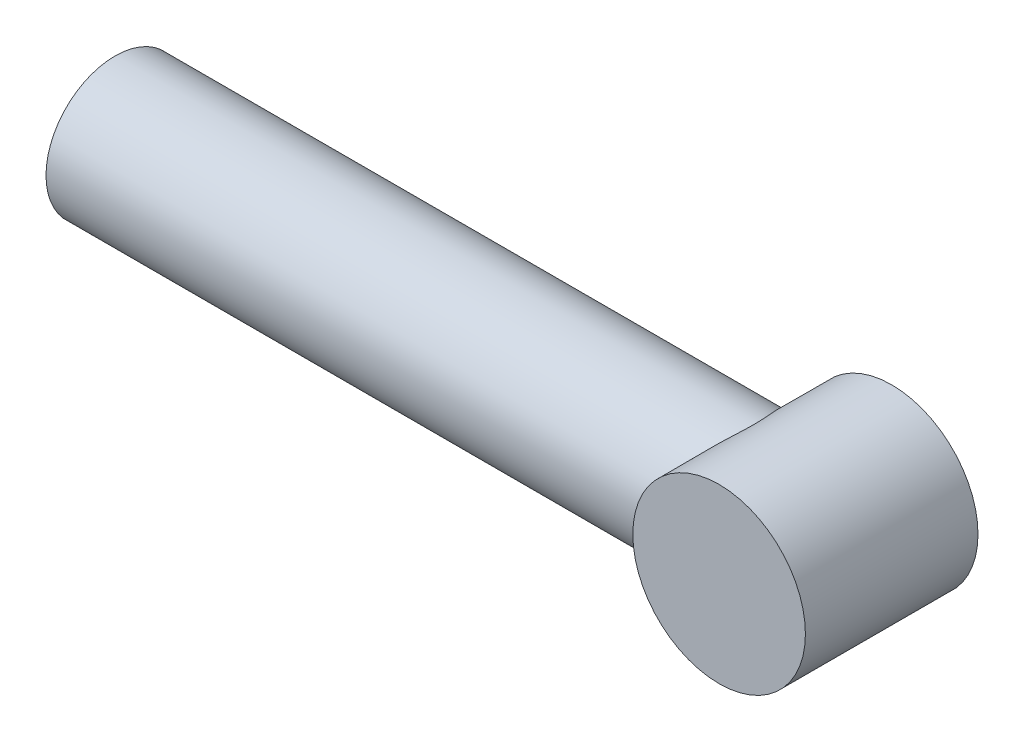
ISO-10303-21;
HEADER;
FILE_DESCRIPTION(('STEP AP214'),'2;1');
FILE_NAME('part.step','',(''),(''),'','','');
FILE_SCHEMA(('AUTOMOTIVE_DESIGN { 1 0 10303 214 1 1 1 1 }'));
ENDSEC;
DATA;
#1=APPLICATION_CONTEXT('core data for automotive mechanical design processes');
#2=APPLICATION_PROTOCOL_DEFINITION('international standard','automotive_design',2000,#1);
#3=PRODUCT_CONTEXT('',#1,'mechanical');
#4=PRODUCT('Part','Part','',(#3));
#5=PRODUCT_RELATED_PRODUCT_CATEGORY('part','',(#4));
#6=PRODUCT_DEFINITION_FORMATION('','',#4);
#7=PRODUCT_DEFINITION_CONTEXT('part definition',#1,'design');
#8=PRODUCT_DEFINITION('design','',#6,#7);
#9=PRODUCT_DEFINITION_SHAPE('','',#8);
#10=(LENGTH_UNIT() NAMED_UNIT(*) SI_UNIT(.MILLI.,.METRE.));
#11=(NAMED_UNIT(*) PLANE_ANGLE_UNIT() SI_UNIT($,.RADIAN.));
#12=(NAMED_UNIT(*) SI_UNIT($,.STERADIAN.) SOLID_ANGLE_UNIT());
#13=UNCERTAINTY_MEASURE_WITH_UNIT(LENGTH_MEASURE(1.E-05),#10,'distance_accuracy_value','');
#14=(GEOMETRIC_REPRESENTATION_CONTEXT(3) GLOBAL_UNCERTAINTY_ASSIGNED_CONTEXT((#13)) GLOBAL_UNIT_ASSIGNED_CONTEXT((#10,
#11,#12)) REPRESENTATION_CONTEXT('',''));
#15=CARTESIAN_POINT('',(0.,0.,0.));
#16=DIRECTION('',(0.,0.,1.));
#17=DIRECTION('',(1.,0.,0.));
#18=AXIS2_PLACEMENT_3D('',#15,#16,#17);
#19=CARTESIAN_POINT('',(200.,0.,0.));
#20=DIRECTION('',(-1.,0.,0.));
#21=DIRECTION('',(0.,0.,1.));
#22=AXIS2_PLACEMENT_3D('',#19,#20,#21);
#23=CYLINDRICAL_SURFACE('',#22,40.);
#24=CARTESIAN_POINT('',(-200.,0.,0.));
#25=DIRECTION('',(1.,0.,0.));
#26=DIRECTION('',(0.,0.,-1.));
#27=AXIS2_PLACEMENT_3D('',#24,#25,#26);
#28=CIRCLE('',#27,40.);
#29=CARTESIAN_POINT('',(-200.,0.,-40.));
#30=VERTEX_POINT('',#29);
#31=EDGE_CURVE('E55',#30,#30,#28,.T.);
#32=ORIENTED_EDGE('',*,*,#31,.T.);
#33=EDGE_LOOP('',(#32));
#34=FACE_BOUND('',#33,.T.);
#35=CARTESIAN_POINT('',(150.,0.,40.));
#36=CARTESIAN_POINT('',(150.000009713421,-0.960337317603065,39.9999899655505));
#37=CARTESIAN_POINT('',(150.027738093411,-1.92103825174153,39.965344130341));
#38=CARTESIAN_POINT('',(150.138036575608,-3.83460710770069,39.8273406683373));
#39=CARTESIAN_POINT('',(150.220635700476,-4.78747061392242,39.7239466787068));
#40=CARTESIAN_POINT('',(150.438963093926,-6.67920680850692,39.4500093404149));
#41=CARTESIAN_POINT('',(150.574792912782,-7.6180491730509,39.2793376397602));
#42=CARTESIAN_POINT('',(150.896514362471,-9.47278784316619,38.8737383716902));
#43=CARTESIAN_POINT('',(151.082400408243,-10.3886866962233,38.6388179728265));
#44=CARTESIAN_POINT('',(151.499010365285,-12.1860448986504,38.1100030483728));
#45=CARTESIAN_POINT('',(151.729439229498,-13.0676873720396,37.8164961975772));
#46=CARTESIAN_POINT('',(152.231519331761,-14.7981074225095,37.1734863365716));
#47=CARTESIAN_POINT('',(152.503170827585,-15.6468847940366,36.8239829762036));
#48=CARTESIAN_POINT('',(153.082928762828,-17.3078631155302,36.0730992030751));
#49=CARTESIAN_POINT('',(153.391026088426,-18.1200731398626,35.6717317573903));
#50=CARTESIAN_POINT('',(154.039000463517,-19.7058441108158,34.8208209286232));
#51=CARTESIAN_POINT('',(154.378884012283,-20.4793971034718,34.3712676903186));
#52=CARTESIAN_POINT('',(154.970397265871,-21.7405090451485,33.5813865490857));
#53=CARTESIAN_POINT('',(155.214721621661,-22.2391661899703,33.2531653527831));
#54=CARTESIAN_POINT('',(155.71404829788,-23.2175821753519,32.5775571715156));
#55=CARTESIAN_POINT('',(155.969048336455,-23.6973450123228,32.2301742772419));
#56=CARTESIAN_POINT('',(156.748143381878,-25.1083888673531,31.1602744893447));
#57=CARTESIAN_POINT('',(157.286249209809,-26.0112478729574,30.4101180866672));
#58=CARTESIAN_POINT('',(158.389203946291,-27.7416200402566,28.8404448127059));
#59=CARTESIAN_POINT('',(158.954120035809,-28.5689268910585,28.0207491560547));
#60=CARTESIAN_POINT('',(160.097228323747,-30.1449198378464,26.3178577666689));
#61=CARTESIAN_POINT('',(160.675419005744,-30.8936148601352,25.4346692627179));
#62=CARTESIAN_POINT('',(161.841235230747,-32.322928156125,23.5925581067076));
#63=CARTESIAN_POINT('',(162.42886684111,-33.0022979067521,22.6326666595117));
#64=CARTESIAN_POINT('',(163.298699586356,-33.9588113294495,21.145835545534));
#65=CARTESIAN_POINT('',(163.586789697094,-34.2673057721559,20.6422403953403));
#66=CARTESIAN_POINT('',(164.156795460499,-34.8630820045459,19.6192733098945));
#67=CARTESIAN_POINT('',(164.438711722438,-35.1503658941105,19.0999029436206));
#68=CARTESIAN_POINT('',(164.993119025265,-35.7025344651925,18.0466515838975));
#69=CARTESIAN_POINT('',(165.265633401255,-35.9674773777477,17.5128134287131));
#70=CARTESIAN_POINT('',(165.79923868526,-36.4752457872218,16.4290760361571));
#71=CARTESIAN_POINT('',(166.060329022893,-36.7180701804527,15.8791759991228));
#72=CARTESIAN_POINT('',(166.567711527861,-37.1806380629351,14.7636195685688));
#73=CARTESIAN_POINT('',(166.81401489761,-37.4003991215583,14.1979755903776));
#74=CARTESIAN_POINT('',(167.288470170828,-37.8160719858136,13.0505560059611));
#75=CARTESIAN_POINT('',(167.516623295865,-38.0119853969403,12.4687814889329));
#76=CARTESIAN_POINT('',(167.983430430793,-38.4063287968087,11.2008152379521));
#77=CARTESIAN_POINT('',(168.218532227984,-38.6007341429587,10.51204347045));
#78=CARTESIAN_POINT('',(168.653015703361,-38.9543981140488,9.11450642112965));
#79=CARTESIAN_POINT('',(168.852403046248,-39.1136623136884,8.4057443306725));
#80=CARTESIAN_POINT('',(169.208376411789,-39.3945089701146,6.97174066571736));
#81=CARTESIAN_POINT('',(169.36505241666,-39.5161707194822,6.24653727800037));
#82=CARTESIAN_POINT('',(169.629842951554,-39.7200407558248,4.78173507298083));
#83=CARTESIAN_POINT('',(169.737958073255,-39.802249523505,4.04213643118804));
#84=CARTESIAN_POINT('',(169.90133192227,-39.9259430521321,2.54689613390493));
#85=CARTESIAN_POINT('',(169.956108748981,-39.9670566128739,1.79117012816373));
#86=CARTESIAN_POINT('',(170.008270075565,-40.0062151100752,0.276633037623785));
#87=CARTESIAN_POINT('',(170.005657407385,-40.0042621716977,-0.482177893098519));
#88=CARTESIAN_POINT('',(169.943160850268,-39.9573259270323,-1.99661799876617));
#89=CARTESIAN_POINT('',(169.88323541198,-39.9123114028992,-2.75224446591342));
#90=CARTESIAN_POINT('',(169.709146200742,-39.7803459798636,-4.25349313675358));
#91=CARTESIAN_POINT('',(169.594974845164,-39.6933892181461,-4.99911392684136));
#92=CARTESIAN_POINT('',(169.296008176701,-39.4627146667173,-6.59074393125148));
#93=CARTESIAN_POINT('',(169.1029604656,-39.3122468772218,-7.43421699833316));
#94=CARTESIAN_POINT('',(168.661660374706,-38.9613603015859,-9.09582896297411));
#95=CARTESIAN_POINT('',(168.413396080961,-38.7609307341793,-9.91396234958124));
#96=CARTESIAN_POINT('',(167.871685925527,-38.3131195376455,-11.5241061197849));
#97=CARTESIAN_POINT('',(167.578129945175,-38.0656231233099,-12.3160469643134));
#98=CARTESIAN_POINT('',(166.956213556036,-37.5270208256944,-13.8708234257715));
#99=CARTESIAN_POINT('',(166.627850365585,-37.2359114562595,-14.6336567098979));
#100=CARTESIAN_POINT('',(166.03194818967,-36.6918302323134,-15.939723098304));
#101=CARTESIAN_POINT('',(165.770184364865,-36.4479938970039,-16.4894565575485));
#102=CARTESIAN_POINT('',(165.235272407108,-35.9381443116079,-17.5729419964088));
#103=CARTESIAN_POINT('',(164.96212313639,-35.6721288424559,-18.106692369607));
#104=CARTESIAN_POINT('',(164.407174210366,-35.1184343896659,-19.1585214005948));
#105=CARTESIAN_POINT('',(164.125371268155,-34.830747112645,-19.6765939513846));
#106=CARTESIAN_POINT('',(163.555730905886,-34.2342731018837,-20.6969491526196));
#107=CARTESIAN_POINT('',(163.267893658131,-33.9254869700272,-21.1992322528916));
#108=CARTESIAN_POINT('',(162.398052086122,-32.9672187050626,-22.6837299484833));
#109=CARTESIAN_POINT('',(161.810265099411,-32.2863649639095,-23.6425733340181));
#110=CARTESIAN_POINT('',(160.635434104939,-30.8431085653317,-25.4967141258071));
#111=CARTESIAN_POINT('',(160.04838999102,-30.080719317879,-26.3920219414511));
#112=CARTESIAN_POINT('',(158.87294522888,-28.453465810621,-28.1400802220676));
#113=CARTESIAN_POINT('',(158.284929547637,-27.5864034467277,-28.9910480559512));
#114=CARTESIAN_POINT('',(157.137422757778,-25.7673359763549,-30.619173293891));
#115=CARTESIAN_POINT('',(156.577935861927,-24.8153183815294,-31.3963198114988));
#116=CARTESIAN_POINT('',(155.771056129462,-23.3263522450451,-32.5001847567502));
#117=CARTESIAN_POINT('',(155.507733313988,-22.8204057830619,-32.857506572597));
#118=CARTESIAN_POINT('',(154.993237673055,-21.7881562398975,-33.5508979727016));
#119=CARTESIAN_POINT('',(154.742064079216,-21.2618544498928,-33.8869689013912));
#120=CARTESIAN_POINT('',(154.253674713914,-20.1896164803325,-34.5365326010554));
#121=CARTESIAN_POINT('',(154.016452058659,-19.6436902020075,-34.8500365246383));
#122=CARTESIAN_POINT('',(153.557460186188,-18.5324581411746,-35.4534605272054));
#123=CARTESIAN_POINT('',(153.33569469413,-17.9671477357558,-35.7433749239427));
#124=CARTESIAN_POINT('',(152.818864727025,-16.5741428935081,-36.4159796166101));
#125=CARTESIAN_POINT('',(152.53262712217,-15.7368978450571,-36.7858371895076));
#126=CARTESIAN_POINT('',(151.999878351874,-14.0281401888326,-37.4707619183103));
#127=CARTESIAN_POINT('',(151.753357326221,-13.1566361533906,-37.7858426748891));
#128=CARTESIAN_POINT('',(151.416793121347,-11.8271364104959,-38.2143395421982));
#129=CARTESIAN_POINT('',(151.310149844974,-11.3803061331231,-38.3498069925522));
#130=CARTESIAN_POINT('',(151.108428258599,-10.4798425549219,-38.6055950227049));
#131=CARTESIAN_POINT('',(151.013347990559,-10.0262104205506,-38.725918167107));
#132=CARTESIAN_POINT('',(150.746165099454,-8.65593274931266,-39.0635293235024));
#133=CARTESIAN_POINT('',(150.592094944512,-7.72980603591299,-39.2574913728039));
#134=CARTESIAN_POINT('',(150.33484077448,-5.85430089988323,-39.5807738677692));
#135=CARTESIAN_POINT('',(150.231929855416,-4.90482549587214,-39.7097474435064));
#136=CARTESIAN_POINT('',(150.080570452958,-2.99469380809515,-39.8992821622338));
#137=CARTESIAN_POINT('',(150.032121878594,-2.03403754300765,-39.9598434194948));
#138=CARTESIAN_POINT('',(149.990861092169,-0.109806201052153,-40.0114260092202));
#139=CARTESIAN_POINT('',(149.99804100758,0.853768443514832,-40.0024571815618));
#140=CARTESIAN_POINT('',(150.067846240705,2.7757092792124,-39.9151684805633));
#141=CARTESIAN_POINT('',(150.130468722916,3.73407573418376,-39.8368521538656));
#142=CARTESIAN_POINT('',(150.302366907066,5.56031714729821,-39.6214404340059));
#143=CARTESIAN_POINT('',(150.407442520729,6.42922228763287,-39.4896329529416));
#144=CARTESIAN_POINT('',(150.661073901886,8.15026869061224,-39.1706393757356));
#145=CARTESIAN_POINT('',(150.80962685544,9.00241103437018,-38.9834568635668));
#146=CARTESIAN_POINT('',(151.147532809455,10.685185547352,-38.5562009958302));
#147=CARTESIAN_POINT('',(151.336893796815,11.5158134700989,-38.3161172862959));
#148=CARTESIAN_POINT('',(151.753178916234,13.1512899928912,-37.7860115062731));
#149=CARTESIAN_POINT('',(151.980105127244,13.9561371632225,-37.4959866718843));
#150=CARTESIAN_POINT('',(152.483031422219,15.58553393233,-36.8497760072204));
#151=CARTESIAN_POINT('',(152.761196571962,16.4082310798128,-36.4906105635653));
#152=CARTESIAN_POINT('',(153.351374173275,18.0177856508563,-35.7233034147602));
#153=CARTESIAN_POINT('',(153.663387627406,18.8046420118585,-35.3151602588883));
#154=CARTESIAN_POINT('',(154.316618484345,20.3402264231708,-34.4535954645144));
#155=CARTESIAN_POINT('',(154.657831031472,21.0889607800987,-34.000181352289));
#156=CARTESIAN_POINT('',(155.365009194038,22.547156358329,-33.0512114826342));
#157=CARTESIAN_POINT('',(155.730978507768,23.2566116830179,-32.5556494260746));
#158=CARTESIAN_POINT('',(156.330595256086,24.3557219690513,-31.7342195200155));
#159=CARTESIAN_POINT('',(156.557760090292,24.7584580160788,-31.4209733975836));
#160=CARTESIAN_POINT('',(157.01820508667,25.5494559230754,-30.78122748881));
#161=CARTESIAN_POINT('',(157.251483819309,25.9377211160471,-30.4547307910537));
#162=CARTESIAN_POINT('',(157.959241403694,27.0809500209275,-29.4558421711984));
#163=CARTESIAN_POINT('',(158.441614246961,27.8142972392493,-28.7640890541843));
#164=CARTESIAN_POINT('',(159.420791354452,29.2244228834484,-27.3303350541018));
#165=CARTESIAN_POINT('',(159.91763150542,29.9010409793003,-26.5882018190992));
#166=CARTESIAN_POINT('',(160.916447265573,31.1952511829746,-25.0571569661297));
#167=CARTESIAN_POINT('',(161.418423210905,31.8128393994679,-24.2682422698134));
#168=CARTESIAN_POINT('',(162.221776377332,32.7570649064664,-22.963979946549));
#169=CARTESIAN_POINT('',(162.524437406622,33.1026381609827,-22.4630065075668));
#170=CARTESIAN_POINT('',(163.126031257113,33.7714763386967,-21.4443141791751));
#171=CARTESIAN_POINT('',(163.424964694939,34.0947449927636,-20.9265981116709));
#172=CARTESIAN_POINT('',(164.016876287504,34.7188696490502,-19.8739710030736));
#173=CARTESIAN_POINT('',(164.309850590662,35.0197114710879,-19.3390493839981));
#174=CARTESIAN_POINT('',(164.886919086001,35.5982931437609,-18.2521387352772));
#175=CARTESIAN_POINT('',(165.171012999604,35.876032270115,-17.7001491712869));
#176=CARTESIAN_POINT('',(165.726241652606,36.4068189966516,-16.5808866575559));
#177=CARTESIAN_POINT('',(165.997418305232,36.659949690076,-16.0136740248487));
#178=CARTESIAN_POINT('',(166.524420031174,37.1417962141712,-14.8619199206453));
#179=CARTESIAN_POINT('',(166.780244268005,37.37051071504,-14.277377507514));
#180=CARTESIAN_POINT('',(167.272344997004,37.8022171685462,-13.091600973481));
#181=CARTESIAN_POINT('',(167.508642619088,38.0052370554788,-12.4903858610512));
#182=CARTESIAN_POINT('',(167.957631372883,38.3845411057123,-11.2709649526988));
#183=CARTESIAN_POINT('',(168.170325055955,38.5608281593336,-10.6527610021372));
#184=CARTESIAN_POINT('',(168.58257203191,38.897575926953,-9.35218977975284));
#185=CARTESIAN_POINT('',(168.779886253723,39.0558044682243,-8.66852466279375));
#186=CARTESIAN_POINT('',(169.135595848407,39.3375156387851,-7.28413538690891));
#187=CARTESIAN_POINT('',(169.293997985898,39.4610043079249,-6.58341421638277));
#188=CARTESIAN_POINT('',(169.565772538329,39.6709888377274,-5.16935839309226));
#189=CARTESIAN_POINT('',(169.679243907126,39.757566023523,-4.45605511360454));
#190=CARTESIAN_POINT('',(169.856830603471,39.8923788269256,-3.01965791766803));
#191=CARTESIAN_POINT('',(169.920946260694,39.9406147006359,-2.29656406664884));
#192=CARTESIAN_POINT('',(169.997017695863,39.9977924999235,-0.842077194983811));
#193=CARTESIAN_POINT('',(170.008686888131,40.0065185319396,-0.110660418364678));
#194=CARTESIAN_POINT('',(169.978506300971,39.9838747579982,1.35041092533592));
#195=CARTESIAN_POINT('',(169.936657450851,39.9525056482675,2.08006552279609));
#196=CARTESIAN_POINT('',(169.801384373207,39.850353927955,3.53274167534831));
#197=CARTESIAN_POINT('',(169.707889452015,39.7795172926711,4.25575275456557));
#198=CARTESIAN_POINT('',(169.473504678449,39.5999333237637,5.6892369354008));
#199=CARTESIAN_POINT('',(169.332607502825,39.4911801322553,6.39970808184355));
#200=CARTESIAN_POINT('',(168.964615492094,39.2029776592161,7.99708822347029));
#201=CARTESIAN_POINT('',(168.724479257589,39.0123208743918,8.87897247143851));
#202=CARTESIAN_POINT('',(168.189073036264,38.5769832571289,10.6120481513389));
#203=CARTESIAN_POINT('',(167.893784895929,38.3322846317051,11.4632293668374));
#204=CARTESIAN_POINT('',(167.259695048441,37.7921453327399,13.1349650275383));
#205=CARTESIAN_POINT('',(166.920790088327,37.4965836739564,13.95544063569));
#206=CARTESIAN_POINT('',(166.210968153998,36.8582295147521,15.5633966668762));
#207=CARTESIAN_POINT('',(165.840049918162,36.5154351526028,16.3508757877219));
#208=CARTESIAN_POINT('',(165.179902195069,35.8846591043814,17.6826467099844));
#209=CARTESIAN_POINT('',(164.896004436015,35.6072491818316,18.2346562511275));
#210=CARTESIAN_POINT('',(164.319253855908,35.0292876905311,19.3216968557099));
#211=CARTESIAN_POINT('',(164.026400257048,34.7287341083094,19.8567264361816));
#212=CARTESIAN_POINT('',(163.434418441058,34.104885410554,20.9100838876258));
#213=CARTESIAN_POINT('',(163.135288083771,33.7815824468452,21.4284059039466));
#214=CARTESIAN_POINT('',(162.53333139218,33.1127063182206,22.4481724792795));
#215=CARTESIAN_POINT('',(162.230505151047,32.7671337137693,22.9496174625561));
#216=CARTESIAN_POINT('',(161.319274497402,31.6966775337519,24.4295880724518));
#217=CARTESIAN_POINT('',(160.708568270348,30.9385234165528,25.3829607031962));
#218=CARTESIAN_POINT('',(159.497449550543,29.3351889955648,27.2200771578111));
#219=CARTESIAN_POINT('',(158.897035448126,28.4900224478867,28.1038319489423));
#220=CARTESIAN_POINT('',(157.712898273737,26.7014356696774,29.8090613790159));
#221=CARTESIAN_POINT('',(157.129500980357,25.7568637916352,30.6295577229048));
#222=CARTESIAN_POINT('',(156.0020340963,23.7796863680122,32.1886736909573));
#223=CARTESIAN_POINT('',(155.457971038811,22.7470662599228,32.9272797244364));
#224=CARTESIAN_POINT('',(154.683092929137,21.1360479259286,33.9657874678806));
#225=CARTESIAN_POINT('',(154.431902754651,20.5892776142864,34.300086907713));
#226=CARTESIAN_POINT('',(153.944759855982,19.4752209561246,34.9446670765635));
#227=CARTESIAN_POINT('',(153.708804725752,18.9079378713406,35.254951599766));
#228=CARTESIAN_POINT('',(153.254014870765,17.7538005313285,35.8500196571099));
#229=CARTESIAN_POINT('',(153.035172977207,17.1669546195832,36.1348138765464));
#230=CARTESIAN_POINT('',(152.616315256413,15.9745348982222,36.6775591965356));
#231=CARTESIAN_POINT('',(152.416297086702,15.3689634313584,36.9355136375252));
#232=CARTESIAN_POINT('',(151.971093666301,13.9274237415026,37.507578036524));
#233=CARTESIAN_POINT('',(151.734240067837,13.084263340767,37.8102180458277));
#234=CARTESIAN_POINT('',(151.301885738625,11.369920378681,38.360595909525));
#235=CARTESIAN_POINT('',(151.106381922597,10.4987399136155,38.6083378601558));
#236=CARTESIAN_POINT('',(150.760745656136,8.73506769004315,39.0451272892425));
#237=CARTESIAN_POINT('',(150.610511603389,7.84262857965284,39.2343062315347));
#238=CARTESIAN_POINT('',(150.357903118004,6.04063896159295,39.5518275913771));
#239=CARTESIAN_POINT('',(150.255507381222,5.13109625886363,39.6801970899428));
#240=CARTESIAN_POINT('',(150.118972337891,3.5177614432962,39.8512087980055));
#241=CARTESIAN_POINT('',(150.074414914397,2.81621264179269,39.9069489166212));
#242=CARTESIAN_POINT('',(150.029798974355,1.76151114851001,39.9627464265366));
#243=CARTESIAN_POINT('',(150.018630353836,1.40950530367482,39.976710157916));
#244=CARTESIAN_POINT('',(150.003728147944,0.705016037755384,39.9953399567366));
#245=CARTESIAN_POINT('',(149.999996434277,0.35253251878188,40.00000368357));
#246=CARTESIAN_POINT('',(150.,0.,40.));
#247=B_SPLINE_CURVE_WITH_KNOTS('',3,(#35,#36,#37,#38,#39,#40,#41,#42,#43,#44,#45,#46,#47,#48,
#49,#50,#51,#52,#53,#54,#55,#56,#57,#58,#59,#60,#61,#62,#63,#64,#65,#66,#67,#68,#69,#70,#71,#72,
#73,#74,#75,#76,#77,#78,#79,#80,#81,#82,#83,#84,#85,#86,#87,#88,#89,#90,#91,#92,#93,#94,#95,#96,
#97,#98,#99,#100,#101,#102,#103,#104,#105,#106,#107,#108,#109,#110,#111,#112,#113,#114,#115,
#116,#117,#118,#119,#120,#121,#122,#123,#124,#125,#126,#127,#128,#129,#130,#131,#132,#133,#134,
#135,#136,#137,#138,#139,#140,#141,#142,#143,#144,#145,#146,#147,#148,#149,#150,#151,#152,#153,
#154,#155,#156,#157,#158,#159,#160,#161,#162,#163,#164,#165,#166,#167,#168,#169,#170,#171,#172,
#173,#174,#175,#176,#177,#178,#179,#180,#181,#182,#183,#184,#185,#186,#187,#188,#189,#190,#191,
#192,#193,#194,#195,#196,#197,#198,#199,#200,#201,#202,#203,#204,#205,#206,#207,#208,#209,#210,
#211,#212,#213,#214,#215,#216,#217,#218,#219,#220,#221,#222,#223,#224,#225,#226,#227,#228,#229,
#230,#231,#232,#233,#234,#235,#236,#237,#238,#239,#240,#241,#242,#243,#244,#245,#246),
.UNSPECIFIED.,.T.,.F.,(4,2,2,2,2,2,2,2,2,2,2,2,2,2,2,2,2,2,2,2,2,2,2,2,2,2,2,2,2,2,2,2,2,2,2,2,
2,2,2,2,2,2,2,2,2,2,2,2,2,2,2,2,2,2,2,2,2,2,2,2,2,2,2,2,2,2,2,2,2,2,2,2,2,2,2,2,2,2,2,2,2,2,2,2,
2,2,2,2,2,2,2,2,2,2,2,2,2,2,2,2,2,2,2,2,2,4),(0.,2.88062758615679,5.76278003074698,
8.65045784797841,11.5378136037629,14.4066614925712,17.2755273215981,20.1436772586725,
23.0124149288824,24.9469208273241,26.8810153286382,30.749879343647,34.6290105291467,
38.507700765339,42.4470818946003,44.4179128084292,46.3885483442504,48.3538775799512,
50.3193048295859,52.2832238029098,54.2470104861715,56.505158357952,58.7629477451065,
61.0159431092657,63.268911021651,65.5420502165159,67.8150772411175,70.0897533648501,
72.3647475419903,74.9955216323603,77.6268639103998,80.2647076887451,82.9027624329285,
84.8697610369223,86.8369566796517,88.8049089923121,90.7728051889146,94.7124150123824,
98.6513778901095,102.695863563299,106.740944754875,108.759483006771,110.777893428343,
112.795299404486,114.813189903704,117.687325407657,120.560746262904,121.997183290601,
123.433376737503,126.305440568867,129.19267556847,132.079905745442,134.9667273299,
137.853401282022,140.505730689314,143.157888470558,145.810565801165,148.463389986564,
151.280030848168,154.096755159395,156.913011968713,159.729690417735,161.404844892208,
163.079611121496,166.429347142809,169.788251812516,173.147377753238,175.18598961902,
177.224259657292,179.263807723302,181.303419706099,183.335886303556,185.368463540742,
187.398811693755,189.428940171327,191.613888302885,193.798456325765,195.978186014466,
198.157901143391,200.349512624176,202.541086049539,204.735666783287,206.930586717202,
209.727217531656,212.524770498097,215.329072235659,218.133484539455,220.172557144903,
222.211807348122,224.251764542407,226.291670416716,230.374537434967,234.456759966271,
238.592973263586,242.72987199107,244.794153116108,246.85810743095,248.921192463368,
250.98402041954,253.760898388863,256.537569090672,259.307960673146,262.07711732055,
264.190991665153,265.248182085266,266.305638543539),.UNSPECIFIED.);
#248=CARTESIAN_POINT('',(150.,0.,40.));
#249=VERTEX_POINT('',#248);
#250=EDGE_CURVE('E12',#249,#249,#247,.T.);
#251=ORIENTED_EDGE('',*,*,#250,.F.);
#252=EDGE_LOOP('',(#251));
#253=FACE_BOUND('',#252,.T.);
#254=ADVANCED_FACE('F44',(#34,#253),#23,.T.);
#255=CARTESIAN_POINT('',(-200.,0.,0.));
#256=DIRECTION('',(1.,0.,0.));
#257=DIRECTION('',(0.,0.,-1.));
#258=AXIS2_PLACEMENT_3D('',#255,#256,#257);
#259=PLANE('',#258);
#260=ORIENTED_EDGE('',*,*,#31,.F.);
#261=EDGE_LOOP('',(#260));
#262=FACE_BOUND('',#261,.T.);
#263=ADVANCED_FACE('F82',(#262),#259,.F.);
#264=CARTESIAN_POINT('',(200.,0.,50.));
#265=DIRECTION('',(0.,0.,-1.));
#266=DIRECTION('',(-1.,0.,0.));
#267=AXIS2_PLACEMENT_3D('',#264,#265,#266);
#268=CYLINDRICAL_SURFACE('',#267,50.);
#269=CARTESIAN_POINT('',(200.,0.,-50.));
#270=DIRECTION('',(0.,0.,1.));
#271=DIRECTION('',(1.,0.,0.));
#272=AXIS2_PLACEMENT_3D('',#269,#270,#271);
#273=CIRCLE('',#272,50.);
#274=CARTESIAN_POINT('',(250.,0.,-50.));
#275=VERTEX_POINT('',#274);
#276=EDGE_CURVE('E63',#275,#275,#273,.T.);
#277=ORIENTED_EDGE('',*,*,#276,.T.);
#278=EDGE_LOOP('',(#277));
#279=FACE_BOUND('',#278,.T.);
#280=CARTESIAN_POINT('',(200.,0.,50.));
#281=DIRECTION('',(0.,0.,1.));
#282=DIRECTION('',(1.,0.,0.));
#283=AXIS2_PLACEMENT_3D('',#280,#281,#282);
#284=CIRCLE('',#283,50.);
#285=CARTESIAN_POINT('',(250.,0.,50.));
#286=VERTEX_POINT('',#285);
#287=EDGE_CURVE('E59',#286,#286,#284,.T.);
#288=ORIENTED_EDGE('',*,*,#287,.F.);
#289=EDGE_LOOP('',(#288));
#290=FACE_BOUND('',#289,.T.);
#291=ORIENTED_EDGE('',*,*,#250,.T.);
#292=EDGE_LOOP('',(#291));
#293=FACE_BOUND('',#292,.T.);
#294=ADVANCED_FACE('F69',(#279,#290,#293),#268,.T.);
#295=CARTESIAN_POINT('',(200.,0.,50.));
#296=DIRECTION('',(0.,0.,1.));
#297=DIRECTION('',(1.,0.,0.));
#298=AXIS2_PLACEMENT_3D('',#295,#296,#297);
#299=PLANE('',#298);
#300=ORIENTED_EDGE('',*,*,#287,.T.);
#301=EDGE_LOOP('',(#300));
#302=FACE_BOUND('',#301,.T.);
#303=ADVANCED_FACE('F74',(#302),#299,.T.);
#304=CARTESIAN_POINT('',(200.,0.,-50.));
#305=DIRECTION('',(0.,0.,1.));
#306=DIRECTION('',(1.,0.,0.));
#307=AXIS2_PLACEMENT_3D('',#304,#305,#306);
#308=PLANE('',#307);
#309=ORIENTED_EDGE('',*,*,#276,.F.);
#310=EDGE_LOOP('',(#309));
#311=FACE_BOUND('',#310,.T.);
#312=ADVANCED_FACE('F72',(#311),#308,.F.);
#313=CLOSED_SHELL('',(#254,#263,#294,#303,#312));
#314=MANIFOLD_SOLID_BREP('B2',#313);
#315=ADVANCED_BREP_SHAPE_REPRESENTATION('',(#18,#314),#14);
#316=SHAPE_DEFINITION_REPRESENTATION(#9,#315);
ENDSEC;
END-ISO-10303-21;
